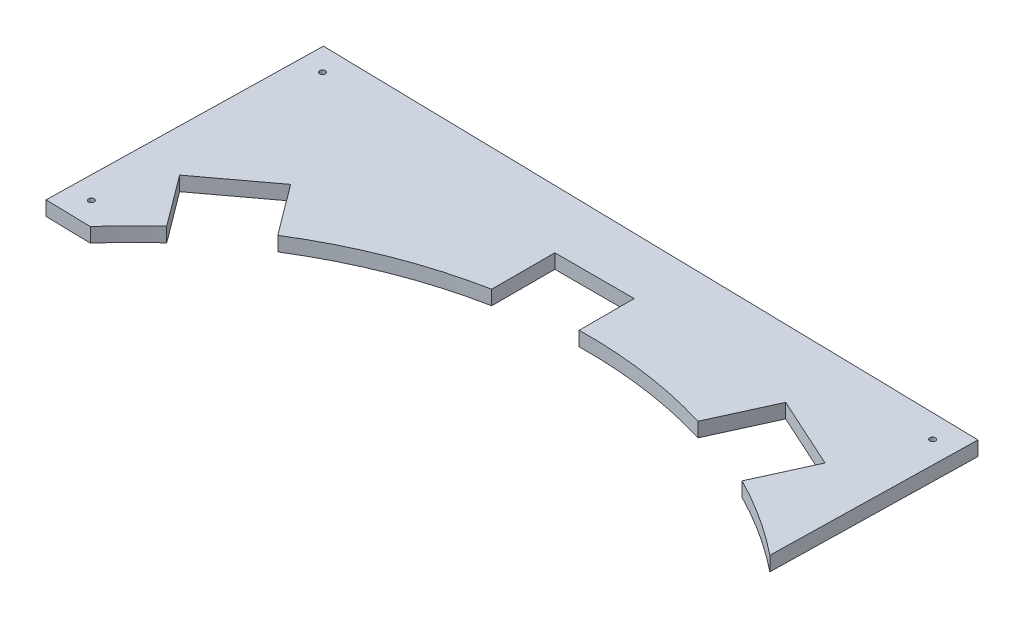
ISO-10303-21;
HEADER;
FILE_DESCRIPTION(('STEP AP214'),'2;1');
FILE_NAME('part.step','',(''),(''),'','','');
FILE_SCHEMA(('AUTOMOTIVE_DESIGN { 1 0 10303 214 1 1 1 1 }'));
ENDSEC;
DATA;
#1=APPLICATION_CONTEXT('core data for automotive mechanical design processes');
#2=APPLICATION_PROTOCOL_DEFINITION('international standard','automotive_design',2000,#1);
#3=PRODUCT_CONTEXT('',#1,'mechanical');
#4=PRODUCT('Part','Part','',(#3));
#5=PRODUCT_RELATED_PRODUCT_CATEGORY('part','',(#4));
#6=PRODUCT_DEFINITION_FORMATION('','',#4);
#7=PRODUCT_DEFINITION_CONTEXT('part definition',#1,'design');
#8=PRODUCT_DEFINITION('design','',#6,#7);
#9=PRODUCT_DEFINITION_SHAPE('','',#8);
#10=(LENGTH_UNIT() NAMED_UNIT(*) SI_UNIT(.MILLI.,.METRE.));
#11=(NAMED_UNIT(*) PLANE_ANGLE_UNIT() SI_UNIT($,.RADIAN.));
#12=(NAMED_UNIT(*) SI_UNIT($,.STERADIAN.) SOLID_ANGLE_UNIT());
#13=UNCERTAINTY_MEASURE_WITH_UNIT(LENGTH_MEASURE(1.E-05),#10,'distance_accuracy_value','');
#14=(GEOMETRIC_REPRESENTATION_CONTEXT(3) GLOBAL_UNCERTAINTY_ASSIGNED_CONTEXT((#13)) GLOBAL_UNIT_ASSIGNED_CONTEXT((#10,
#11,#12)) REPRESENTATION_CONTEXT('',''));
#15=CARTESIAN_POINT('',(0.,0.,0.));
#16=DIRECTION('',(0.,0.,1.));
#17=DIRECTION('',(1.,0.,0.));
#18=AXIS2_PLACEMENT_3D('',#15,#16,#17);
#19=CARTESIAN_POINT('',(137.591950977565,6.35,74.1556586034928));
#20=DIRECTION('',(0.,-1.,0.));
#21=DIRECTION('',(0.,0.,-1.));
#22=AXIS2_PLACEMENT_3D('',#19,#20,#21);
#23=PLANE('',#22);
#24=CARTESIAN_POINT('',(137.591950977565,6.35,74.1556586034928));
#25=DIRECTION('',(0.,-1.,0.));
#26=DIRECTION('',(0.,0.,-1.));
#27=AXIS2_PLACEMENT_3D('',#24,#25,#26);
#28=CIRCLE('',#27,200.);
#29=CARTESIAN_POINT('',(-12.8843250448444,6.35,-57.589892951114));
#30=VERTEX_POINT('',#29);
#31=CARTESIAN_POINT('',(3.84705979839139,6.35,-74.5464062223559));
#32=VERTEX_POINT('',#31);
#33=EDGE_CURVE('E217',#30,#32,#28,.T.);
#34=ORIENTED_EDGE('',*,*,#33,.T.);
#35=DIRECTION('',(-0.597683872955401,0.,-0.801731867901627));
#36=VECTOR('',#35,1.);
#37=CARTESIAN_POINT('',(3.84705979839139,6.35,-74.5464062223559));
#38=LINE('',#37,#36);
#39=CARTESIAN_POINT('',(-12.8707896422369,6.35,-96.9716936791805));
#40=VERTEX_POINT('',#39);
#41=EDGE_CURVE('E120',#32,#40,#38,.T.);
#42=ORIENTED_EDGE('',*,*,#41,.T.);
#43=DIRECTION('',(0.801731867901627,0.,-0.597683872955401));
#44=VECTOR('',#43,1.);
#45=CARTESIAN_POINT('',(-12.8707896422369,6.35,-96.9716936791805));
#46=LINE('',#45,#44);
#47=CARTESIAN_POINT('',(15.18982573432,6.35,-117.89062923262));
#48=VERTEX_POINT('',#47);
#49=EDGE_CURVE('E259',#40,#48,#46,.T.);
#50=ORIENTED_EDGE('',*,*,#49,.T.);
#51=DIRECTION('',(0.597683872955402,0.,0.801731867901627));
#52=VECTOR('',#51,1.);
#53=CARTESIAN_POINT('',(15.18982573432,6.35,-117.89062923262));
#54=LINE('',#53,#52);
#55=CARTESIAN_POINT('',(31.8183514543856,6.35,-95.5851604233694));
#56=VERTEX_POINT('',#55);
#57=EDGE_CURVE('E278',#48,#56,#54,.T.);
#58=ORIENTED_EDGE('',*,*,#57,.T.);
#59=CARTESIAN_POINT('',(137.591950977565,6.35,74.1556586034928));
#60=DIRECTION('',(0.,-1.,0.));
#61=DIRECTION('',(0.,0.,-1.));
#62=AXIS2_PLACEMENT_3D('',#59,#60,#61);
#63=CIRCLE('',#62,200.);
#64=CARTESIAN_POINT('',(99.6149319715244,6.35,-122.205605467135));
#65=VERTEX_POINT('',#64);
#66=EDGE_CURVE('E275',#56,#65,#63,.T.);
#67=ORIENTED_EDGE('',*,*,#66,.T.);
#68=DIRECTION('',(0.,0.,-1.));
#69=VECTOR('',#68,1.);
#70=CARTESIAN_POINT('',(99.6149319715244,6.35,-122.205605467135));
#71=LINE('',#70,#69);
#72=CARTESIAN_POINT('',(99.6149319715244,6.35,-150.073013142539));
#73=VERTEX_POINT('',#72);
#74=EDGE_CURVE('E277',#65,#73,#71,.T.);
#75=ORIENTED_EDGE('',*,*,#74,.T.);
#76=DIRECTION('',(1.,0.,0.));
#77=VECTOR('',#76,1.);
#78=CARTESIAN_POINT('',(99.6149319715244,6.35,-150.073013142539));
#79=LINE('',#78,#77);
#80=CARTESIAN_POINT('',(134.614931971524,6.35,-150.073013142539));
#81=VERTEX_POINT('',#80);
#82=EDGE_CURVE('E280',#73,#81,#79,.T.);
#83=ORIENTED_EDGE('',*,*,#82,.T.);
#84=DIRECTION('',(0.,0.,1.));
#85=VECTOR('',#84,1.);
#86=CARTESIAN_POINT('',(134.614931971524,6.35,-150.073013142539));
#87=LINE('',#86,#85);
#88=CARTESIAN_POINT('',(134.614931971524,6.35,-125.822183563678));
#89=VERTEX_POINT('',#88);
#90=EDGE_CURVE('E286',#81,#89,#87,.T.);
#91=ORIENTED_EDGE('',*,*,#90,.T.);
#92=CARTESIAN_POINT('',(137.591950977565,6.35,74.1556586034928));
#93=DIRECTION('',(0.,-1.,0.));
#94=DIRECTION('',(0.,0.,-1.));
#95=AXIS2_PLACEMENT_3D('',#92,#93,#94);
#96=CIRCLE('',#95,200.);
#97=CARTESIAN_POINT('',(195.598020496109,6.35,-117.247831174019));
#98=VERTEX_POINT('',#97);
#99=EDGE_CURVE('E288',#89,#98,#96,.T.);
#100=ORIENTED_EDGE('',*,*,#99,.T.);
#101=DIRECTION('',(0.414499042727727,0.,-0.910049747858763));
#102=VECTOR('',#101,1.);
#103=CARTESIAN_POINT('',(195.598020496109,6.35,-117.247831174019));
#104=LINE('',#103,#102);
#105=CARTESIAN_POINT('',(207.713903894391,6.35,-143.848752997946));
#106=VERTEX_POINT('',#105);
#107=EDGE_CURVE('E290',#98,#106,#104,.T.);
#108=ORIENTED_EDGE('',*,*,#107,.T.);
#109=DIRECTION('',(0.910049747858763,0.,0.414499042727727));
#110=VECTOR('',#109,1.);
#111=CARTESIAN_POINT('',(207.713903894391,6.35,-143.848752997946));
#112=LINE('',#111,#110);
#113=CARTESIAN_POINT('',(239.565645069448,6.35,-129.341286502476));
#114=VERTEX_POINT('',#113);
#115=EDGE_CURVE('E292',#106,#114,#112,.T.);
#116=ORIENTED_EDGE('',*,*,#115,.T.);
#117=DIRECTION('',(-0.414499042727727,0.,0.910049747858763));
#118=VECTOR('',#117,1.);
#119=CARTESIAN_POINT('',(239.565645069448,6.35,-129.341286502476));
#120=LINE('',#119,#118);
#121=CARTESIAN_POINT('',(228.109303454441,6.35,-104.188415872159));
#122=VERTEX_POINT('',#121);
#123=EDGE_CURVE('E294',#114,#122,#120,.T.);
#124=ORIENTED_EDGE('',*,*,#123,.T.);
#125=CARTESIAN_POINT('',(137.591950977565,6.35,74.1556586034928));
#126=DIRECTION('',(0.,-1.,0.));
#127=DIRECTION('',(0.,0.,-1.));
#128=AXIS2_PLACEMENT_3D('',#125,#126,#127);
#129=CIRCLE('',#128,200.);
#130=CARTESIAN_POINT('',(262.67460643496,6.35,-81.9030781071657));
#131=VERTEX_POINT('',#130);
#132=EDGE_CURVE('E296',#122,#131,#129,.T.);
#133=ORIENTED_EDGE('',*,*,#132,.T.);
#134=DIRECTION('',(0.0205868474608925,0.,-0.999788068398309));
#135=VECTOR('',#134,1.);
#136=CARTESIAN_POINT('',(264.527815459998,6.35,-171.903078107166));
#137=LINE('',#136,#135);
#138=CARTESIAN_POINT('',(264.527815459998,6.35,-171.903078107166));
#139=VERTEX_POINT('',#138);
#140=EDGE_CURVE('E166',#131,#139,#137,.T.);
#141=ORIENTED_EDGE('',*,*,#140,.T.);
#142=DIRECTION('',(-0.999788068398309,0.,-0.0205868474608924));
#143=VECTOR('',#142,1.);
#144=CARTESIAN_POINT('',(-30.4096647175035,6.35,-177.976198108129));
#145=LINE('',#144,#143);
#146=CARTESIAN_POINT('',(-30.4096647175035,6.35,-177.976198108129));
#147=VERTEX_POINT('',#146);
#148=EDGE_CURVE('E160',#139,#147,#145,.T.);
#149=ORIENTED_EDGE('',*,*,#148,.T.);
#150=DIRECTION('',(-0.0205868474608922,0.,0.999788068398309));
#151=VECTOR('',#150,1.);
#152=CARTESIAN_POINT('',(-32.8800864128106,6.35,-58.0016299003319));
#153=LINE('',#152,#151);
#154=CARTESIAN_POINT('',(-32.8800864128106,6.35,-58.0016299003319));
#155=VERTEX_POINT('',#154);
#156=EDGE_CURVE('E164',#147,#155,#153,.T.);
#157=ORIENTED_EDGE('',*,*,#156,.T.);
#158=DIRECTION('',(0.999788068398309,0.,0.0205868474608923));
#159=VECTOR('',#158,1.);
#160=CARTESIAN_POINT('',(-12.8843250448444,6.35,-57.589892951114));
#161=LINE('',#160,#159);
#162=EDGE_CURVE('E50',#155,#30,#161,.T.);
#163=ORIENTED_EDGE('',*,*,#162,.T.);
#164=EDGE_LOOP('',(#34,#42,#50,#58,#67,#75,#83,#91,#100,#108,#116,#124,#133,#141,#149,#157,#163));
#165=FACE_BOUND('',#164,.T.);
#166=CARTESIAN_POINT('',(-20.6176525081293,6.35,-167.772448949537));
#167=DIRECTION('',(0.,1.,0.));
#168=DIRECTION('',(0.,0.,1.));
#169=AXIS2_PLACEMENT_3D('',#166,#167,#168);
#170=CIRCLE('',#169,1.25);
#171=CARTESIAN_POINT('',(-20.6176525081293,6.35,-166.522448949537));
#172=VERTEX_POINT('',#171);
#173=EDGE_CURVE('E188',#172,#172,#170,.T.);
#174=ORIENTED_EDGE('',*,*,#173,.F.);
#175=EDGE_LOOP('',(#174));
#176=FACE_BOUND('',#175,.T.);
#177=CARTESIAN_POINT('',(254.324066301406,6.35,-162.111065897792));
#178=DIRECTION('',(0.,1.,0.));
#179=DIRECTION('',(0.,0.,1.));
#180=AXIS2_PLACEMENT_3D('',#177,#178,#179);
#181=CIRCLE('',#180,1.24999999999996);
#182=CARTESIAN_POINT('',(254.324066301406,6.35,-160.861065897792));
#183=VERTEX_POINT('',#182);
#184=EDGE_CURVE('E350',#183,#183,#181,.T.);
#185=ORIENTED_EDGE('',*,*,#184,.F.);
#186=EDGE_LOOP('',(#185));
#187=FACE_BOUND('',#186,.T.);
#188=CARTESIAN_POINT('',(-22.6763372542185,6.35,-67.793642109706));
#189=DIRECTION('',(0.,1.,0.));
#190=DIRECTION('',(0.,0.,1.));
#191=AXIS2_PLACEMENT_3D('',#188,#189,#190);
#192=CIRCLE('',#191,1.25);
#193=CARTESIAN_POINT('',(-22.6763372542185,6.35,-66.543642109706));
#194=VERTEX_POINT('',#193);
#195=EDGE_CURVE('E341',#194,#194,#192,.T.);
#196=ORIENTED_EDGE('',*,*,#195,.F.);
#197=EDGE_LOOP('',(#196));
#198=FACE_BOUND('',#197,.T.);
#199=ADVANCED_FACE('F33',(#165,#176,#187,#198),#23,.F.);
#200=CARTESIAN_POINT('',(137.591950977565,0.,74.1556586034928));
#201=DIRECTION('',(0.,-1.,0.));
#202=DIRECTION('',(0.,0.,-1.));
#203=AXIS2_PLACEMENT_3D('',#200,#201,#202);
#204=PLANE('',#203);
#205=CARTESIAN_POINT('',(254.324066301406,0.,-162.111065897792));
#206=DIRECTION('',(0.,1.,0.));
#207=DIRECTION('',(0.,0.,1.));
#208=AXIS2_PLACEMENT_3D('',#205,#206,#207);
#209=CIRCLE('',#208,1.24999999999996);
#210=CARTESIAN_POINT('',(254.324066301406,0.,-160.861065897792));
#211=VERTEX_POINT('',#210);
#212=EDGE_CURVE('E347',#211,#211,#209,.T.);
#213=ORIENTED_EDGE('',*,*,#212,.T.);
#214=EDGE_LOOP('',(#213));
#215=FACE_BOUND('',#214,.T.);
#216=CARTESIAN_POINT('',(137.591950977565,0.,74.1556586034928));
#217=DIRECTION('',(0.,-1.,0.));
#218=DIRECTION('',(0.,0.,-1.));
#219=AXIS2_PLACEMENT_3D('',#216,#217,#218);
#220=CIRCLE('',#219,200.);
#221=CARTESIAN_POINT('',(-12.8843250448444,0.,-57.589892951114));
#222=VERTEX_POINT('',#221);
#223=CARTESIAN_POINT('',(3.84705979839139,0.,-74.5464062223559));
#224=VERTEX_POINT('',#223);
#225=EDGE_CURVE('E184',#222,#224,#220,.T.);
#226=ORIENTED_EDGE('',*,*,#225,.F.);
#227=DIRECTION('',(0.999788068398309,0.,0.0205868474608923));
#228=VECTOR('',#227,1.);
#229=CARTESIAN_POINT('',(-12.8843250448444,0.,-57.589892951114));
#230=LINE('',#229,#228);
#231=CARTESIAN_POINT('',(-32.8800864128106,0.,-58.0016299003319));
#232=VERTEX_POINT('',#231);
#233=EDGE_CURVE('E112',#232,#222,#230,.T.);
#234=ORIENTED_EDGE('',*,*,#233,.F.);
#235=DIRECTION('',(-0.0205868474608922,0.,0.999788068398309));
#236=VECTOR('',#235,1.);
#237=CARTESIAN_POINT('',(-32.8800864128106,0.,-58.0016299003319));
#238=LINE('',#237,#236);
#239=CARTESIAN_POINT('',(-30.4096647175035,0.,-177.976198108129));
#240=VERTEX_POINT('',#239);
#241=EDGE_CURVE('E106',#240,#232,#238,.T.);
#242=ORIENTED_EDGE('',*,*,#241,.F.);
#243=DIRECTION('',(-0.999788068398309,0.,-0.0205868474608924));
#244=VECTOR('',#243,1.);
#245=CARTESIAN_POINT('',(-30.4096647175035,0.,-177.976198108129));
#246=LINE('',#245,#244);
#247=CARTESIAN_POINT('',(264.527815459998,0.,-171.903078107166));
#248=VERTEX_POINT('',#247);
#249=EDGE_CURVE('E174',#248,#240,#246,.T.);
#250=ORIENTED_EDGE('',*,*,#249,.F.);
#251=DIRECTION('',(0.0205868474608925,0.,-0.999788068398309));
#252=VECTOR('',#251,1.);
#253=CARTESIAN_POINT('',(264.527815459998,0.,-171.903078107166));
#254=LINE('',#253,#252);
#255=CARTESIAN_POINT('',(262.67460643496,0.,-81.9030781071657));
#256=VERTEX_POINT('',#255);
#257=EDGE_CURVE('E212',#256,#248,#254,.T.);
#258=ORIENTED_EDGE('',*,*,#257,.F.);
#259=CARTESIAN_POINT('',(137.591950977565,0.,74.1556586034928));
#260=DIRECTION('',(0.,-1.,0.));
#261=DIRECTION('',(0.,0.,-1.));
#262=AXIS2_PLACEMENT_3D('',#259,#260,#261);
#263=CIRCLE('',#262,200.);
#264=CARTESIAN_POINT('',(228.109303454441,0.,-104.188415872159));
#265=VERTEX_POINT('',#264);
#266=EDGE_CURVE('E210',#265,#256,#263,.T.);
#267=ORIENTED_EDGE('',*,*,#266,.F.);
#268=DIRECTION('',(-0.414499042727727,0.,0.910049747858763));
#269=VECTOR('',#268,1.);
#270=CARTESIAN_POINT('',(239.565645069448,0.,-129.341286502476));
#271=LINE('',#270,#269);
#272=CARTESIAN_POINT('',(239.565645069448,0.,-129.341286502476));
#273=VERTEX_POINT('',#272);
#274=EDGE_CURVE('E208',#273,#265,#271,.T.);
#275=ORIENTED_EDGE('',*,*,#274,.F.);
#276=DIRECTION('',(0.910049747858763,0.,0.414499042727727));
#277=VECTOR('',#276,1.);
#278=CARTESIAN_POINT('',(207.713903894391,0.,-143.848752997946));
#279=LINE('',#278,#277);
#280=CARTESIAN_POINT('',(207.713903894391,0.,-143.848752997946));
#281=VERTEX_POINT('',#280);
#282=EDGE_CURVE('E206',#281,#273,#279,.T.);
#283=ORIENTED_EDGE('',*,*,#282,.F.);
#284=DIRECTION('',(0.414499042727727,0.,-0.910049747858763));
#285=VECTOR('',#284,1.);
#286=CARTESIAN_POINT('',(195.598020496109,0.,-117.247831174019));
#287=LINE('',#286,#285);
#288=CARTESIAN_POINT('',(195.598020496109,0.,-117.247831174019));
#289=VERTEX_POINT('',#288);
#290=EDGE_CURVE('E204',#289,#281,#287,.T.);
#291=ORIENTED_EDGE('',*,*,#290,.F.);
#292=CARTESIAN_POINT('',(137.591950977565,0.,74.1556586034928));
#293=DIRECTION('',(0.,-1.,0.));
#294=DIRECTION('',(0.,0.,-1.));
#295=AXIS2_PLACEMENT_3D('',#292,#293,#294);
#296=CIRCLE('',#295,200.);
#297=CARTESIAN_POINT('',(134.614931971524,0.,-125.822183563678));
#298=VERTEX_POINT('',#297);
#299=EDGE_CURVE('E202',#298,#289,#296,.T.);
#300=ORIENTED_EDGE('',*,*,#299,.F.);
#301=DIRECTION('',(0.,0.,1.));
#302=VECTOR('',#301,1.);
#303=CARTESIAN_POINT('',(134.614931971524,0.,-150.073013142539));
#304=LINE('',#303,#302);
#305=CARTESIAN_POINT('',(134.614931971524,0.,-150.073013142539));
#306=VERTEX_POINT('',#305);
#307=EDGE_CURVE('E200',#306,#298,#304,.T.);
#308=ORIENTED_EDGE('',*,*,#307,.F.);
#309=DIRECTION('',(1.,0.,0.));
#310=VECTOR('',#309,1.);
#311=CARTESIAN_POINT('',(99.6149319715244,0.,-150.073013142539));
#312=LINE('',#311,#310);
#313=CARTESIAN_POINT('',(99.6149319715244,0.,-150.073013142539));
#314=VERTEX_POINT('',#313);
#315=EDGE_CURVE('E198',#314,#306,#312,.T.);
#316=ORIENTED_EDGE('',*,*,#315,.F.);
#317=DIRECTION('',(0.,0.,-1.));
#318=VECTOR('',#317,1.);
#319=CARTESIAN_POINT('',(99.6149319715244,0.,-122.205605467135));
#320=LINE('',#319,#318);
#321=CARTESIAN_POINT('',(99.6149319715244,0.,-122.205605467135));
#322=VERTEX_POINT('',#321);
#323=EDGE_CURVE('E196',#322,#314,#320,.T.);
#324=ORIENTED_EDGE('',*,*,#323,.F.);
#325=CARTESIAN_POINT('',(137.591950977565,0.,74.1556586034928));
#326=DIRECTION('',(0.,-1.,0.));
#327=DIRECTION('',(0.,0.,-1.));
#328=AXIS2_PLACEMENT_3D('',#325,#326,#327);
#329=CIRCLE('',#328,200.);
#330=CARTESIAN_POINT('',(31.8183514543856,0.,-95.5851604233694));
#331=VERTEX_POINT('',#330);
#332=EDGE_CURVE('E194',#331,#322,#329,.T.);
#333=ORIENTED_EDGE('',*,*,#332,.F.);
#334=DIRECTION('',(0.597683872955402,0.,0.801731867901627));
#335=VECTOR('',#334,1.);
#336=CARTESIAN_POINT('',(15.18982573432,0.,-117.89062923262));
#337=LINE('',#336,#335);
#338=CARTESIAN_POINT('',(15.18982573432,0.,-117.89062923262));
#339=VERTEX_POINT('',#338);
#340=EDGE_CURVE('E192',#339,#331,#337,.T.);
#341=ORIENTED_EDGE('',*,*,#340,.F.);
#342=DIRECTION('',(0.801731867901627,0.,-0.597683872955401));
#343=VECTOR('',#342,1.);
#344=CARTESIAN_POINT('',(-12.8707896422369,0.,-96.9716936791805));
#345=LINE('',#344,#343);
#346=CARTESIAN_POINT('',(-12.8707896422369,0.,-96.9716936791805));
#347=VERTEX_POINT('',#346);
#348=EDGE_CURVE('E190',#347,#339,#345,.T.);
#349=ORIENTED_EDGE('',*,*,#348,.F.);
#350=DIRECTION('',(-0.597683872955401,0.,-0.801731867901627));
#351=VECTOR('',#350,1.);
#352=CARTESIAN_POINT('',(3.84705979839139,0.,-74.5464062223559));
#353=LINE('',#352,#351);
#354=EDGE_CURVE('E187',#224,#347,#353,.T.);
#355=ORIENTED_EDGE('',*,*,#354,.F.);
#356=EDGE_LOOP('',(#226,#234,#242,#250,#258,#267,#275,#283,#291,#300,#308,#316,#324,#333,#341,
#349,#355));
#357=FACE_BOUND('',#356,.T.);
#358=CARTESIAN_POINT('',(-20.6176525081293,0.,-167.772448949537));
#359=DIRECTION('',(0.,1.,0.));
#360=DIRECTION('',(0.,0.,1.));
#361=AXIS2_PLACEMENT_3D('',#358,#359,#360);
#362=CIRCLE('',#361,1.25);
#363=CARTESIAN_POINT('',(-20.6176525081293,0.,-166.522448949537));
#364=VERTEX_POINT('',#363);
#365=EDGE_CURVE('E353',#364,#364,#362,.T.);
#366=ORIENTED_EDGE('',*,*,#365,.T.);
#367=EDGE_LOOP('',(#366));
#368=FACE_BOUND('',#367,.T.);
#369=CARTESIAN_POINT('',(-22.6763372542185,0.,-67.793642109706));
#370=DIRECTION('',(0.,1.,0.));
#371=DIRECTION('',(0.,0.,1.));
#372=AXIS2_PLACEMENT_3D('',#369,#370,#371);
#373=CIRCLE('',#372,1.25);
#374=CARTESIAN_POINT('',(-22.6763372542185,0.,-66.543642109706));
#375=VERTEX_POINT('',#374);
#376=EDGE_CURVE('E344',#375,#375,#373,.T.);
#377=ORIENTED_EDGE('',*,*,#376,.T.);
#378=EDGE_LOOP('',(#377));
#379=FACE_BOUND('',#378,.T.);
#380=ADVANCED_FACE('F263',(#215,#357,#368,#379),#204,.T.);
#381=CARTESIAN_POINT('',(137.591950977565,6.35,74.1556586034928));
#382=DIRECTION('',(0.,-1.,0.));
#383=DIRECTION('',(0.,0.,-1.));
#384=AXIS2_PLACEMENT_3D('',#381,#382,#383);
#385=CYLINDRICAL_SURFACE('',#384,200.);
#386=ORIENTED_EDGE('',*,*,#225,.T.);
#387=DIRECTION('',(0.,-1.,0.));
#388=VECTOR('',#387,1.);
#389=CARTESIAN_POINT('',(3.84705979839139,6.35,-74.5464062223559));
#390=LINE('',#389,#388);
#391=EDGE_CURVE('E11',#32,#224,#390,.T.);
#392=ORIENTED_EDGE('',*,*,#391,.F.);
#393=ORIENTED_EDGE('',*,*,#33,.F.);
#394=DIRECTION('',(0.,-1.,0.));
#395=VECTOR('',#394,1.);
#396=CARTESIAN_POINT('',(-12.8843250448444,6.35,-57.589892951114));
#397=LINE('',#396,#395);
#398=EDGE_CURVE('E180',#30,#222,#397,.T.);
#399=ORIENTED_EDGE('',*,*,#398,.T.);
#400=EDGE_LOOP('',(#386,#392,#393,#399));
#401=FACE_BOUND('',#400,.T.);
#402=ADVANCED_FACE('F35',(#401),#385,.F.);
#403=CARTESIAN_POINT('',(3.84705979839139,6.35,-74.5464062223559));
#404=DIRECTION('',(-0.801731867901627,0.,0.597683872955401));
#405=DIRECTION('',(0.597683872955401,0.,0.801731867901627));
#406=AXIS2_PLACEMENT_3D('',#403,#404,#405);
#407=PLANE('',#406);
#408=ORIENTED_EDGE('',*,*,#354,.T.);
#409=DIRECTION('',(0.,-1.,0.));
#410=VECTOR('',#409,1.);
#411=CARTESIAN_POINT('',(-12.8707896422369,6.35,-96.9716936791805));
#412=LINE('',#411,#410);
#413=EDGE_CURVE('E42',#40,#347,#412,.T.);
#414=ORIENTED_EDGE('',*,*,#413,.F.);
#415=ORIENTED_EDGE('',*,*,#41,.F.);
#416=ORIENTED_EDGE('',*,*,#391,.T.);
#417=EDGE_LOOP('',(#408,#414,#415,#416));
#418=FACE_BOUND('',#417,.T.);
#419=ADVANCED_FACE('F506',(#418),#407,.F.);
#420=CARTESIAN_POINT('',(-12.8707896422369,6.35,-96.9716936791805));
#421=DIRECTION('',(-0.597683872955401,0.,-0.801731867901627));
#422=DIRECTION('',(-0.801731867901627,0.,0.597683872955401));
#423=AXIS2_PLACEMENT_3D('',#420,#421,#422);
#424=PLANE('',#423);
#425=ORIENTED_EDGE('',*,*,#348,.T.);
#426=DIRECTION('',(0.,-1.,0.));
#427=VECTOR('',#426,1.);
#428=CARTESIAN_POINT('',(15.18982573432,6.35,-117.89062923262));
#429=LINE('',#428,#427);
#430=EDGE_CURVE('E251',#48,#339,#429,.T.);
#431=ORIENTED_EDGE('',*,*,#430,.F.);
#432=ORIENTED_EDGE('',*,*,#49,.F.);
#433=ORIENTED_EDGE('',*,*,#413,.T.);
#434=EDGE_LOOP('',(#425,#431,#432,#433));
#435=FACE_BOUND('',#434,.T.);
#436=ADVANCED_FACE('F257',(#435),#424,.F.);
#437=CARTESIAN_POINT('',(15.18982573432,6.35,-117.89062923262));
#438=DIRECTION('',(0.801731867901627,0.,-0.597683872955402));
#439=DIRECTION('',(-0.597683872955402,0.,-0.801731867901627));
#440=AXIS2_PLACEMENT_3D('',#437,#438,#439);
#441=PLANE('',#440);
#442=ORIENTED_EDGE('',*,*,#340,.T.);
#443=DIRECTION('',(0.,-1.,0.));
#444=VECTOR('',#443,1.);
#445=CARTESIAN_POINT('',(31.8183514543856,6.35,-95.5851604233694));
#446=LINE('',#445,#444);
#447=EDGE_CURVE('E248',#56,#331,#446,.T.);
#448=ORIENTED_EDGE('',*,*,#447,.F.);
#449=ORIENTED_EDGE('',*,*,#57,.F.);
#450=ORIENTED_EDGE('',*,*,#430,.T.);
#451=EDGE_LOOP('',(#442,#448,#449,#450));
#452=FACE_BOUND('',#451,.T.);
#453=ADVANCED_FACE('F269',(#452),#441,.F.);
#454=CARTESIAN_POINT('',(137.591950977565,6.35,74.1556586034928));
#455=DIRECTION('',(0.,-1.,0.));
#456=DIRECTION('',(0.,0.,-1.));
#457=AXIS2_PLACEMENT_3D('',#454,#455,#456);
#458=CYLINDRICAL_SURFACE('',#457,200.);
#459=ORIENTED_EDGE('',*,*,#332,.T.);
#460=DIRECTION('',(0.,-1.,0.));
#461=VECTOR('',#460,1.);
#462=CARTESIAN_POINT('',(99.6149319715244,6.35,-122.205605467135));
#463=LINE('',#462,#461);
#464=EDGE_CURVE('E245',#65,#322,#463,.T.);
#465=ORIENTED_EDGE('',*,*,#464,.F.);
#466=ORIENTED_EDGE('',*,*,#66,.F.);
#467=ORIENTED_EDGE('',*,*,#447,.T.);
#468=EDGE_LOOP('',(#459,#465,#466,#467));
#469=FACE_BOUND('',#468,.T.);
#470=ADVANCED_FACE('F273',(#469),#458,.F.);
#471=CARTESIAN_POINT('',(99.6149319715244,6.35,-122.205605467135));
#472=DIRECTION('',(-1.,0.,0.));
#473=DIRECTION('',(0.,0.,1.));
#474=AXIS2_PLACEMENT_3D('',#471,#472,#473);
#475=PLANE('',#474);
#476=ORIENTED_EDGE('',*,*,#323,.T.);
#477=DIRECTION('',(0.,-1.,0.));
#478=VECTOR('',#477,1.);
#479=CARTESIAN_POINT('',(99.6149319715244,6.35,-150.073013142539));
#480=LINE('',#479,#478);
#481=EDGE_CURVE('E242',#73,#314,#480,.T.);
#482=ORIENTED_EDGE('',*,*,#481,.F.);
#483=ORIENTED_EDGE('',*,*,#74,.F.);
#484=ORIENTED_EDGE('',*,*,#464,.T.);
#485=EDGE_LOOP('',(#476,#482,#483,#484));
#486=FACE_BOUND('',#485,.T.);
#487=ADVANCED_FACE('F471',(#486),#475,.F.);
#488=CARTESIAN_POINT('',(99.6149319715244,6.35,-150.073013142539));
#489=DIRECTION('',(0.,0.,-1.));
#490=DIRECTION('',(-1.,0.,0.));
#491=AXIS2_PLACEMENT_3D('',#488,#489,#490);
#492=PLANE('',#491);
#493=ORIENTED_EDGE('',*,*,#315,.T.);
#494=DIRECTION('',(0.,-1.,0.));
#495=VECTOR('',#494,1.);
#496=CARTESIAN_POINT('',(134.614931971524,6.35,-150.073013142539));
#497=LINE('',#496,#495);
#498=EDGE_CURVE('E239',#81,#306,#497,.T.);
#499=ORIENTED_EDGE('',*,*,#498,.F.);
#500=ORIENTED_EDGE('',*,*,#82,.F.);
#501=ORIENTED_EDGE('',*,*,#481,.T.);
#502=EDGE_LOOP('',(#493,#499,#500,#501));
#503=FACE_BOUND('',#502,.T.);
#504=ADVANCED_FACE('F461',(#503),#492,.F.);
#505=CARTESIAN_POINT('',(134.614931971524,6.35,-150.073013142539));
#506=DIRECTION('',(1.,0.,0.));
#507=DIRECTION('',(0.,0.,-1.));
#508=AXIS2_PLACEMENT_3D('',#505,#506,#507);
#509=PLANE('',#508);
#510=ORIENTED_EDGE('',*,*,#307,.T.);
#511=DIRECTION('',(0.,-1.,0.));
#512=VECTOR('',#511,1.);
#513=CARTESIAN_POINT('',(134.614931971524,6.35,-125.822183563678));
#514=LINE('',#513,#512);
#515=EDGE_CURVE('E236',#89,#298,#514,.T.);
#516=ORIENTED_EDGE('',*,*,#515,.F.);
#517=ORIENTED_EDGE('',*,*,#90,.F.);
#518=ORIENTED_EDGE('',*,*,#498,.T.);
#519=EDGE_LOOP('',(#510,#516,#517,#518));
#520=FACE_BOUND('',#519,.T.);
#521=ADVANCED_FACE('F451',(#520),#509,.F.);
#522=CARTESIAN_POINT('',(137.591950977565,6.35,74.1556586034928));
#523=DIRECTION('',(0.,-1.,0.));
#524=DIRECTION('',(0.,0.,-1.));
#525=AXIS2_PLACEMENT_3D('',#522,#523,#524);
#526=CYLINDRICAL_SURFACE('',#525,200.);
#527=ORIENTED_EDGE('',*,*,#299,.T.);
#528=DIRECTION('',(0.,-1.,0.));
#529=VECTOR('',#528,1.);
#530=CARTESIAN_POINT('',(195.598020496109,6.35,-117.247831174019));
#531=LINE('',#530,#529);
#532=EDGE_CURVE('E233',#98,#289,#531,.T.);
#533=ORIENTED_EDGE('',*,*,#532,.F.);
#534=ORIENTED_EDGE('',*,*,#99,.F.);
#535=ORIENTED_EDGE('',*,*,#515,.T.);
#536=EDGE_LOOP('',(#527,#533,#534,#535));
#537=FACE_BOUND('',#536,.T.);
#538=ADVANCED_FACE('F441',(#537),#526,.F.);
#539=CARTESIAN_POINT('',(195.598020496109,6.35,-117.247831174019));
#540=DIRECTION('',(-0.910049747858763,0.,-0.414499042727727));
#541=DIRECTION('',(-0.414499042727727,0.,0.910049747858763));
#542=AXIS2_PLACEMENT_3D('',#539,#540,#541);
#543=PLANE('',#542);
#544=ORIENTED_EDGE('',*,*,#290,.T.);
#545=DIRECTION('',(0.,-1.,0.));
#546=VECTOR('',#545,1.);
#547=CARTESIAN_POINT('',(207.713903894391,6.35,-143.848752997946));
#548=LINE('',#547,#546);
#549=EDGE_CURVE('E230',#106,#281,#548,.T.);
#550=ORIENTED_EDGE('',*,*,#549,.F.);
#551=ORIENTED_EDGE('',*,*,#107,.F.);
#552=ORIENTED_EDGE('',*,*,#532,.T.);
#553=EDGE_LOOP('',(#544,#550,#551,#552));
#554=FACE_BOUND('',#553,.T.);
#555=ADVANCED_FACE('F431',(#554),#543,.F.);
#556=CARTESIAN_POINT('',(207.713903894391,6.35,-143.848752997946));
#557=DIRECTION('',(0.414499042727727,0.,-0.910049747858763));
#558=DIRECTION('',(-0.910049747858763,0.,-0.414499042727727));
#559=AXIS2_PLACEMENT_3D('',#556,#557,#558);
#560=PLANE('',#559);
#561=ORIENTED_EDGE('',*,*,#282,.T.);
#562=DIRECTION('',(0.,-1.,0.));
#563=VECTOR('',#562,1.);
#564=CARTESIAN_POINT('',(239.565645069448,6.35,-129.341286502476));
#565=LINE('',#564,#563);
#566=EDGE_CURVE('E227',#114,#273,#565,.T.);
#567=ORIENTED_EDGE('',*,*,#566,.F.);
#568=ORIENTED_EDGE('',*,*,#115,.F.);
#569=ORIENTED_EDGE('',*,*,#549,.T.);
#570=EDGE_LOOP('',(#561,#567,#568,#569));
#571=FACE_BOUND('',#570,.T.);
#572=ADVANCED_FACE('F421',(#571),#560,.F.);
#573=CARTESIAN_POINT('',(239.565645069448,6.35,-129.341286502476));
#574=DIRECTION('',(0.910049747858763,0.,0.414499042727727));
#575=DIRECTION('',(0.414499042727727,0.,-0.910049747858763));
#576=AXIS2_PLACEMENT_3D('',#573,#574,#575);
#577=PLANE('',#576);
#578=ORIENTED_EDGE('',*,*,#274,.T.);
#579=DIRECTION('',(0.,-1.,0.));
#580=VECTOR('',#579,1.);
#581=CARTESIAN_POINT('',(228.109303454441,6.35,-104.188415872159));
#582=LINE('',#581,#580);
#583=EDGE_CURVE('E224',#122,#265,#582,.T.);
#584=ORIENTED_EDGE('',*,*,#583,.F.);
#585=ORIENTED_EDGE('',*,*,#123,.F.);
#586=ORIENTED_EDGE('',*,*,#566,.T.);
#587=EDGE_LOOP('',(#578,#584,#585,#586));
#588=FACE_BOUND('',#587,.T.);
#589=ADVANCED_FACE('F412',(#588),#577,.F.);
#590=CARTESIAN_POINT('',(137.591950977565,6.35,74.1556586034928));
#591=DIRECTION('',(0.,-1.,0.));
#592=DIRECTION('',(0.,0.,-1.));
#593=AXIS2_PLACEMENT_3D('',#590,#591,#592);
#594=CYLINDRICAL_SURFACE('',#593,200.);
#595=ORIENTED_EDGE('',*,*,#266,.T.);
#596=DIRECTION('',(0.,-1.,0.));
#597=VECTOR('',#596,1.);
#598=CARTESIAN_POINT('',(262.67460643496,6.35,-81.9030781071657));
#599=LINE('',#598,#597);
#600=EDGE_CURVE('E221',#131,#256,#599,.T.);
#601=ORIENTED_EDGE('',*,*,#600,.F.);
#602=ORIENTED_EDGE('',*,*,#132,.F.);
#603=ORIENTED_EDGE('',*,*,#583,.T.);
#604=EDGE_LOOP('',(#595,#601,#602,#603));
#605=FACE_BOUND('',#604,.T.);
#606=ADVANCED_FACE('F302',(#605),#594,.F.);
#607=CARTESIAN_POINT('',(264.527815459998,6.35,-171.903078107166));
#608=DIRECTION('',(-0.999788068398309,0.,-0.0205868474608925));
#609=DIRECTION('',(-0.0205868474608925,0.,0.999788068398309));
#610=AXIS2_PLACEMENT_3D('',#607,#608,#609);
#611=PLANE('',#610);
#612=ORIENTED_EDGE('',*,*,#257,.T.);
#613=DIRECTION('',(0.,-1.,0.));
#614=VECTOR('',#613,1.);
#615=CARTESIAN_POINT('',(264.527815459998,6.35,-171.903078107166));
#616=LINE('',#615,#614);
#617=EDGE_CURVE('E175',#139,#248,#616,.T.);
#618=ORIENTED_EDGE('',*,*,#617,.F.);
#619=ORIENTED_EDGE('',*,*,#140,.F.);
#620=ORIENTED_EDGE('',*,*,#600,.T.);
#621=EDGE_LOOP('',(#612,#618,#619,#620));
#622=FACE_BOUND('',#621,.T.);
#623=ADVANCED_FACE('F306',(#622),#611,.F.);
#624=CARTESIAN_POINT('',(-30.4096647175035,6.35,-177.976198108129));
#625=DIRECTION('',(-0.0205868474608924,0.,0.999788068398309));
#626=DIRECTION('',(0.999788068398309,0.,0.0205868474608924));
#627=AXIS2_PLACEMENT_3D('',#624,#625,#626);
#628=PLANE('',#627);
#629=ORIENTED_EDGE('',*,*,#249,.T.);
#630=DIRECTION('',(0.,-1.,0.));
#631=VECTOR('',#630,1.);
#632=CARTESIAN_POINT('',(-30.4096647175035,6.35,-177.976198108129));
#633=LINE('',#632,#631);
#634=EDGE_CURVE('E171',#147,#240,#633,.T.);
#635=ORIENTED_EDGE('',*,*,#634,.F.);
#636=ORIENTED_EDGE('',*,*,#148,.F.);
#637=ORIENTED_EDGE('',*,*,#617,.T.);
#638=EDGE_LOOP('',(#629,#635,#636,#637));
#639=FACE_BOUND('',#638,.T.);
#640=ADVANCED_FACE('F172',(#639),#628,.F.);
#641=CARTESIAN_POINT('',(-32.8800864128106,6.35,-58.0016299003319));
#642=DIRECTION('',(0.999788068398309,0.,0.0205868474608922));
#643=DIRECTION('',(0.0205868474608922,0.,-0.999788068398309));
#644=AXIS2_PLACEMENT_3D('',#641,#642,#643);
#645=PLANE('',#644);
#646=ORIENTED_EDGE('',*,*,#241,.T.);
#647=DIRECTION('',(0.,-1.,0.));
#648=VECTOR('',#647,1.);
#649=CARTESIAN_POINT('',(-32.8800864128106,6.35,-58.0016299003319));
#650=LINE('',#649,#648);
#651=EDGE_CURVE('E176',#155,#232,#650,.T.);
#652=ORIENTED_EDGE('',*,*,#651,.F.);
#653=ORIENTED_EDGE('',*,*,#156,.F.);
#654=ORIENTED_EDGE('',*,*,#634,.T.);
#655=EDGE_LOOP('',(#646,#652,#653,#654));
#656=FACE_BOUND('',#655,.T.);
#657=ADVANCED_FACE('F178',(#656),#645,.F.);
#658=CARTESIAN_POINT('',(-12.8843250448444,6.35,-57.589892951114));
#659=DIRECTION('',(0.0205868474608923,0.,-0.999788068398309));
#660=DIRECTION('',(-0.999788068398309,0.,-0.0205868474608923));
#661=AXIS2_PLACEMENT_3D('',#658,#659,#660);
#662=PLANE('',#661);
#663=ORIENTED_EDGE('',*,*,#233,.T.);
#664=ORIENTED_EDGE('',*,*,#398,.F.);
#665=ORIENTED_EDGE('',*,*,#162,.F.);
#666=ORIENTED_EDGE('',*,*,#651,.T.);
#667=EDGE_LOOP('',(#663,#664,#665,#666));
#668=FACE_BOUND('',#667,.T.);
#669=ADVANCED_FACE('F310',(#668),#662,.F.);
#670=CARTESIAN_POINT('',(-20.6176525081293,6.35,-167.772448949537));
#671=DIRECTION('',(0.,-1.,0.));
#672=DIRECTION('',(0.,0.,-1.));
#673=AXIS2_PLACEMENT_3D('',#670,#671,#672);
#674=CYLINDRICAL_SURFACE('',#673,1.25);
#675=ORIENTED_EDGE('',*,*,#173,.T.);
#676=EDGE_LOOP('',(#675));
#677=FACE_BOUND('',#676,.T.);
#678=ORIENTED_EDGE('',*,*,#365,.F.);
#679=EDGE_LOOP('',(#678));
#680=FACE_BOUND('',#679,.T.);
#681=ADVANCED_FACE('F312',(#677,#680),#674,.F.);
#682=CARTESIAN_POINT('',(254.324066301406,6.35,-162.111065897792));
#683=DIRECTION('',(0.,-1.,0.));
#684=DIRECTION('',(0.,0.,-1.));
#685=AXIS2_PLACEMENT_3D('',#682,#683,#684);
#686=CYLINDRICAL_SURFACE('',#685,1.24999999999996);
#687=ORIENTED_EDGE('',*,*,#184,.T.);
#688=EDGE_LOOP('',(#687));
#689=FACE_BOUND('',#688,.T.);
#690=ORIENTED_EDGE('',*,*,#212,.F.);
#691=EDGE_LOOP('',(#690));
#692=FACE_BOUND('',#691,.T.);
#693=ADVANCED_FACE('F318',(#689,#692),#686,.F.);
#694=CARTESIAN_POINT('',(-22.6763372542185,6.35,-67.793642109706));
#695=DIRECTION('',(0.,-1.,0.));
#696=DIRECTION('',(0.,0.,-1.));
#697=AXIS2_PLACEMENT_3D('',#694,#695,#696);
#698=CYLINDRICAL_SURFACE('',#697,1.25);
#699=ORIENTED_EDGE('',*,*,#195,.T.);
#700=EDGE_LOOP('',(#699));
#701=FACE_BOUND('',#700,.T.);
#702=ORIENTED_EDGE('',*,*,#376,.F.);
#703=EDGE_LOOP('',(#702));
#704=FACE_BOUND('',#703,.T.);
#705=ADVANCED_FACE('F332',(#701,#704),#698,.F.);
#706=CLOSED_SHELL('',(#199,#380,#402,#419,#436,#453,#470,#487,#504,#521,#538,#555,#572,#589,
#606,#623,#640,#657,#669,#681,#693,#705));
#707=MANIFOLD_SOLID_BREP('B2',#706);
#708=ADVANCED_BREP_SHAPE_REPRESENTATION('',(#18,#707),#14);
#709=SHAPE_DEFINITION_REPRESENTATION(#9,#708);
ENDSEC;
END-ISO-10303-21;
